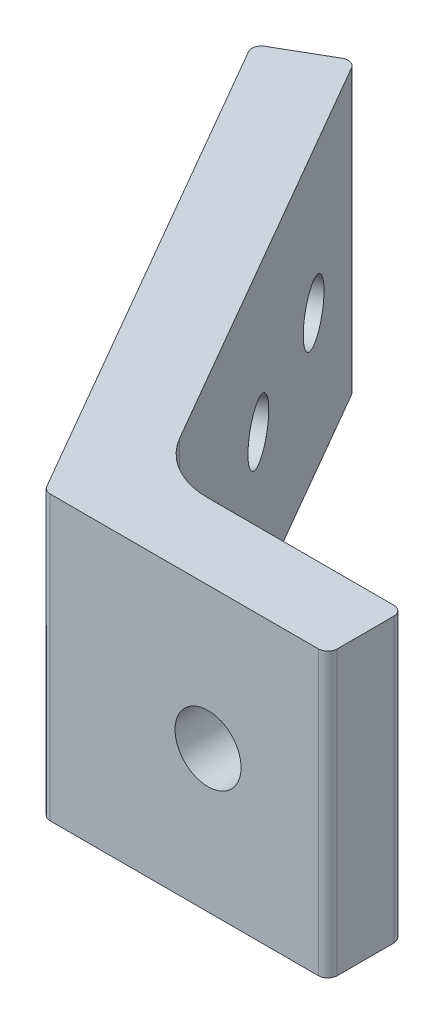
ISO-10303-21;
HEADER;
FILE_DESCRIPTION(('STEP AP214'),'2;1');
FILE_NAME('part.step','',(''),(''),'','','');
FILE_SCHEMA(('AUTOMOTIVE_DESIGN { 1 0 10303 214 1 1 1 1 }'));
ENDSEC;
DATA;
#1=APPLICATION_CONTEXT('core data for automotive mechanical design processes');
#2=APPLICATION_PROTOCOL_DEFINITION('international standard','automotive_design',2000,#1);
#3=PRODUCT_CONTEXT('',#1,'mechanical');
#4=PRODUCT('Part','Part','',(#3));
#5=PRODUCT_RELATED_PRODUCT_CATEGORY('part','',(#4));
#6=PRODUCT_DEFINITION_FORMATION('','',#4);
#7=PRODUCT_DEFINITION_CONTEXT('part definition',#1,'design');
#8=PRODUCT_DEFINITION('design','',#6,#7);
#9=PRODUCT_DEFINITION_SHAPE('','',#8);
#10=(LENGTH_UNIT() NAMED_UNIT(*) SI_UNIT(.MILLI.,.METRE.));
#11=(NAMED_UNIT(*) PLANE_ANGLE_UNIT() SI_UNIT($,.RADIAN.));
#12=(NAMED_UNIT(*) SI_UNIT($,.STERADIAN.) SOLID_ANGLE_UNIT());
#13=UNCERTAINTY_MEASURE_WITH_UNIT(LENGTH_MEASURE(1.E-05),#10,'distance_accuracy_value','');
#14=(GEOMETRIC_REPRESENTATION_CONTEXT(3) GLOBAL_UNCERTAINTY_ASSIGNED_CONTEXT((#13)) GLOBAL_UNIT_ASSIGNED_CONTEXT((#10,
#11,#12)) REPRESENTATION_CONTEXT('',''));
#15=CARTESIAN_POINT('',(0.,0.,0.));
#16=DIRECTION('',(0.,0.,1.));
#17=DIRECTION('',(1.,0.,0.));
#18=AXIS2_PLACEMENT_3D('',#15,#16,#17);
#19=CARTESIAN_POINT('',(-13.5262794416288,7.5,-1.42820323027553));
#20=DIRECTION('',(0.86602540378444,0.,-0.499999999999998));
#21=DIRECTION('',(-0.499999999999998,0.,-0.86602540378444));
#22=AXIS2_PLACEMENT_3D('',#19,#20,#21);
#23=CYLINDRICAL_SURFACE('',#22,1.5);
#24=CARTESIAN_POINT('',(-0.535898384862232,7.5,-8.92820323027551));
#25=DIRECTION('',(0.86602540378444,0.,-0.499999999999998));
#26=DIRECTION('',(-0.499999999999998,0.,-0.86602540378444));
#27=AXIS2_PLACEMENT_3D('',#24,#25,#26);
#28=CIRCLE('',#27,1.5);
#29=CARTESIAN_POINT('',(-1.28589838486223,7.5,-10.2272413359522));
#30=VERTEX_POINT('',#29);
#31=EDGE_CURVE('E170',#30,#30,#28,.T.);
#32=ORIENTED_EDGE('',*,*,#31,.T.);
#33=EDGE_LOOP('',(#32));
#34=FACE_BOUND('',#33,.T.);
#35=CARTESIAN_POINT('',(-3.99999999999999,7.5,-6.92820323027551));
#36=DIRECTION('',(0.86602540378444,0.,-0.499999999999998));
#37=DIRECTION('',(-0.499999999999998,0.,-0.86602540378444));
#38=AXIS2_PLACEMENT_3D('',#35,#36,#37);
#39=CIRCLE('',#38,1.5);
#40=CARTESIAN_POINT('',(-4.74999999999999,7.5,-8.22724133595218));
#41=VERTEX_POINT('',#40);
#42=EDGE_CURVE('E148',#41,#41,#39,.T.);
#43=ORIENTED_EDGE('',*,*,#42,.F.);
#44=EDGE_LOOP('',(#43));
#45=FACE_BOUND('',#44,.T.);
#46=ADVANCED_FACE('F35',(#34,#45),#23,.F.);
#47=CARTESIAN_POINT('',(0.,15.,0.));
#48=DIRECTION('',(0.,0.,-1.));
#49=DIRECTION('',(-1.,0.,0.));
#50=AXIS2_PLACEMENT_3D('',#47,#48,#49);
#51=PLANE('',#50);
#52=CARTESIAN_POINT('',(8.65470053837925,7.5,0.));
#53=DIRECTION('',(0.,0.,-1.));
#54=DIRECTION('',(-1.,0.,0.));
#55=AXIS2_PLACEMENT_3D('',#52,#53,#54);
#56=CIRCLE('',#55,1.75);
#57=CARTESIAN_POINT('',(6.90470053837925,7.5,0.));
#58=VERTEX_POINT('',#57);
#59=EDGE_CURVE('E246',#58,#58,#56,.T.);
#60=ORIENTED_EDGE('',*,*,#59,.T.);
#61=EDGE_LOOP('',(#60));
#62=FACE_BOUND('',#61,.T.);
#63=DIRECTION('',(1.,0.,0.));
#64=VECTOR('',#63,1.);
#65=CARTESIAN_POINT('',(0.,15.,0.));
#66=LINE('',#65,#64);
#67=CARTESIAN_POINT('',(0.288675134594815,15.,0.));
#68=VERTEX_POINT('',#67);
#69=CARTESIAN_POINT('',(14.5,15.,0.));
#70=VERTEX_POINT('',#69);
#71=EDGE_CURVE('E164',#68,#70,#66,.T.);
#72=ORIENTED_EDGE('',*,*,#71,.F.);
#73=DIRECTION('',(0.,-1.,0.));
#74=VECTOR('',#73,1.);
#75=CARTESIAN_POINT('',(0.288675134594815,15.,0.));
#76=LINE('',#75,#74);
#77=CARTESIAN_POINT('',(0.288675134594815,0.,0.));
#78=VERTEX_POINT('',#77);
#79=EDGE_CURVE('E209',#68,#78,#76,.T.);
#80=ORIENTED_EDGE('',*,*,#79,.T.);
#81=DIRECTION('',(1.,0.,0.));
#82=VECTOR('',#81,1.);
#83=CARTESIAN_POINT('',(0.,0.,0.));
#84=LINE('',#83,#82);
#85=CARTESIAN_POINT('',(14.5,0.,0.));
#86=VERTEX_POINT('',#85);
#87=EDGE_CURVE('E168',#78,#86,#84,.T.);
#88=ORIENTED_EDGE('',*,*,#87,.T.);
#89=DIRECTION('',(0.,-1.,0.));
#90=VECTOR('',#89,1.);
#91=CARTESIAN_POINT('',(14.5,15.,0.));
#92=LINE('',#91,#90);
#93=EDGE_CURVE('E207',#86,#70,#92,.F.);
#94=ORIENTED_EDGE('',*,*,#93,.T.);
#95=EDGE_LOOP('',(#72,#80,#88,#94));
#96=FACE_BOUND('',#95,.T.);
#97=ADVANCED_FACE('F269',(#62,#96),#51,.F.);
#98=CARTESIAN_POINT('',(15.,15.,-4.));
#99=DIRECTION('',(-1.,0.,0.));
#100=DIRECTION('',(0.,0.,1.));
#101=AXIS2_PLACEMENT_3D('',#98,#99,#100);
#102=PLANE('',#101);
#103=DIRECTION('',(0.,0.,-1.));
#104=VECTOR('',#103,1.);
#105=CARTESIAN_POINT('',(15.,15.,-4.));
#106=LINE('',#105,#104);
#107=CARTESIAN_POINT('',(15.,15.,-0.499999999999997));
#108=VERTEX_POINT('',#107);
#109=CARTESIAN_POINT('',(15.,15.,-3.5));
#110=VERTEX_POINT('',#109);
#111=EDGE_CURVE('E222',#108,#110,#106,.T.);
#112=ORIENTED_EDGE('',*,*,#111,.F.);
#113=DIRECTION('',(0.,-1.,0.));
#114=VECTOR('',#113,1.);
#115=CARTESIAN_POINT('',(15.,15.,-0.499999999999997));
#116=LINE('',#115,#114);
#117=CARTESIAN_POINT('',(15.,0.,-0.499999999999997));
#118=VERTEX_POINT('',#117);
#119=EDGE_CURVE('E43',#108,#118,#116,.T.);
#120=ORIENTED_EDGE('',*,*,#119,.T.);
#121=DIRECTION('',(0.,0.,-1.));
#122=VECTOR('',#121,1.);
#123=CARTESIAN_POINT('',(15.,0.,-4.));
#124=LINE('',#123,#122);
#125=CARTESIAN_POINT('',(15.,0.,-3.5));
#126=VERTEX_POINT('',#125);
#127=EDGE_CURVE('E159',#118,#126,#124,.T.);
#128=ORIENTED_EDGE('',*,*,#127,.T.);
#129=DIRECTION('',(0.,-1.,0.));
#130=VECTOR('',#129,1.);
#131=CARTESIAN_POINT('',(15.,15.,-3.5));
#132=LINE('',#131,#130);
#133=EDGE_CURVE('E212',#126,#110,#132,.F.);
#134=ORIENTED_EDGE('',*,*,#133,.T.);
#135=EDGE_LOOP('',(#112,#120,#128,#134));
#136=FACE_BOUND('',#135,.T.);
#137=ADVANCED_FACE('F219',(#136),#102,.F.);
#138=CARTESIAN_POINT('',(2.3094010767585,15.,-4.));
#139=DIRECTION('',(0.,0.,1.));
#140=DIRECTION('',(1.,0.,0.));
#141=AXIS2_PLACEMENT_3D('',#138,#139,#140);
#142=PLANE('',#141);
#143=CARTESIAN_POINT('',(8.65470053837925,7.5,-4.));
#144=DIRECTION('',(0.,0.,-1.));
#145=DIRECTION('',(-1.,0.,0.));
#146=AXIS2_PLACEMENT_3D('',#143,#144,#145);
#147=CIRCLE('',#146,1.75);
#148=CARTESIAN_POINT('',(6.90470053837925,7.5,-4.));
#149=VERTEX_POINT('',#148);
#150=EDGE_CURVE('E249',#149,#149,#147,.T.);
#151=ORIENTED_EDGE('',*,*,#150,.F.);
#152=EDGE_LOOP('',(#151));
#153=FACE_BOUND('',#152,.T.);
#154=DIRECTION('',(-1.,0.,0.));
#155=VECTOR('',#154,1.);
#156=CARTESIAN_POINT('',(2.3094010767585,15.,-4.));
#157=LINE('',#156,#155);
#158=CARTESIAN_POINT('',(14.5,15.,-4.));
#159=VERTEX_POINT('',#158);
#160=CARTESIAN_POINT('',(4.61880215351701,15.,-4.));
#161=VERTEX_POINT('',#160);
#162=EDGE_CURVE('E233',#159,#161,#157,.T.);
#163=ORIENTED_EDGE('',*,*,#162,.F.);
#164=DIRECTION('',(0.,-1.,0.));
#165=VECTOR('',#164,1.);
#166=CARTESIAN_POINT('',(14.5,15.,-4.));
#167=LINE('',#166,#165);
#168=CARTESIAN_POINT('',(14.5,0.,-4.));
#169=VERTEX_POINT('',#168);
#170=EDGE_CURVE('E11',#159,#169,#167,.T.);
#171=ORIENTED_EDGE('',*,*,#170,.T.);
#172=DIRECTION('',(-1.,0.,0.));
#173=VECTOR('',#172,1.);
#174=CARTESIAN_POINT('',(2.3094010767585,0.,-4.));
#175=LINE('',#174,#173);
#176=CARTESIAN_POINT('',(4.61880215351701,0.,-4.));
#177=VERTEX_POINT('',#176);
#178=EDGE_CURVE('E154',#169,#177,#175,.T.);
#179=ORIENTED_EDGE('',*,*,#178,.T.);
#180=DIRECTION('',(0.,-1.,0.));
#181=VECTOR('',#180,1.);
#182=CARTESIAN_POINT('',(4.61880215351701,15.,-4.));
#183=LINE('',#182,#181);
#184=EDGE_CURVE('E133',#177,#161,#183,.F.);
#185=ORIENTED_EDGE('',*,*,#184,.T.);
#186=EDGE_LOOP('',(#163,#171,#179,#185));
#187=FACE_BOUND('',#186,.T.);
#188=ADVANCED_FACE('F256',(#153,#187),#142,.F.);
#189=CARTESIAN_POINT('',(-11.5358983848622,15.,-27.9807621135332));
#190=DIRECTION('',(-0.86602540378444,0.,0.499999999999998));
#191=DIRECTION('',(0.499999999999998,0.,0.86602540378444));
#192=AXIS2_PLACEMENT_3D('',#189,#190,#191);
#193=PLANE('',#192);
#194=CARTESIAN_POINT('',(-4.53589838486222,7.5,-15.856406460551));
#195=DIRECTION('',(0.86602540378444,0.,-0.499999999999998));
#196=DIRECTION('',(-0.499999999999998,0.,-0.86602540378444));
#197=AXIS2_PLACEMENT_3D('',#194,#195,#196);
#198=CIRCLE('',#197,1.5);
#199=CARTESIAN_POINT('',(-5.28589838486221,7.5,-17.1554445662277));
#200=VERTEX_POINT('',#199);
#201=EDGE_CURVE('E243',#200,#200,#198,.T.);
#202=ORIENTED_EDGE('',*,*,#201,.F.);
#203=EDGE_LOOP('',(#202));
#204=FACE_BOUND('',#203,.T.);
#205=CARTESIAN_POINT('',(-8.5358983848622,7.5,-22.7846096908265));
#206=DIRECTION('',(0.86602540378444,0.,-0.499999999999998));
#207=DIRECTION('',(-0.499999999999998,0.,-0.86602540378444));
#208=AXIS2_PLACEMENT_3D('',#205,#206,#207);
#209=CIRCLE('',#208,1.5);
#210=CARTESIAN_POINT('',(-9.2858983848622,7.5,-24.0836477965032));
#211=VERTEX_POINT('',#210);
#212=EDGE_CURVE('E169',#211,#211,#209,.T.);
#213=ORIENTED_EDGE('',*,*,#212,.F.);
#214=EDGE_LOOP('',(#213));
#215=FACE_BOUND('',#214,.T.);
#216=DIRECTION('',(-0.499999999999998,0.,-0.86602540378444));
#217=VECTOR('',#216,1.);
#218=CARTESIAN_POINT('',(-11.5358983848622,0.,-27.9807621135332));
#219=LINE('',#218,#217);
#220=CARTESIAN_POINT('',(1.15470053837925,0.,-6.00000000000001));
#221=VERTEX_POINT('',#220);
#222=CARTESIAN_POINT('',(-11.2858983848622,0.,-27.547749411641));
#223=VERTEX_POINT('',#222);
#224=EDGE_CURVE('E144',#221,#223,#219,.T.);
#225=ORIENTED_EDGE('',*,*,#224,.T.);
#226=DIRECTION('',(0.,-1.,0.));
#227=VECTOR('',#226,1.);
#228=CARTESIAN_POINT('',(-11.2858983848622,15.,-27.547749411641));
#229=LINE('',#228,#227);
#230=CARTESIAN_POINT('',(-11.2858983848622,15.,-27.547749411641));
#231=VERTEX_POINT('',#230);
#232=EDGE_CURVE('E192',#223,#231,#229,.F.);
#233=ORIENTED_EDGE('',*,*,#232,.T.);
#234=DIRECTION('',(-0.499999999999998,0.,-0.86602540378444));
#235=VECTOR('',#234,1.);
#236=CARTESIAN_POINT('',(-11.5358983848622,15.,-27.9807621135332));
#237=LINE('',#236,#235);
#238=CARTESIAN_POINT('',(1.15470053837925,15.,-6.00000000000001));
#239=VERTEX_POINT('',#238);
#240=EDGE_CURVE('E147',#239,#231,#237,.T.);
#241=ORIENTED_EDGE('',*,*,#240,.F.);
#242=DIRECTION('',(0.,-1.,0.));
#243=VECTOR('',#242,1.);
#244=CARTESIAN_POINT('',(1.15470053837925,0.,-6.00000000000001));
#245=LINE('',#244,#243);
#246=EDGE_CURVE('E131',#239,#221,#245,.T.);
#247=ORIENTED_EDGE('',*,*,#246,.T.);
#248=EDGE_LOOP('',(#225,#233,#241,#247));
#249=FACE_BOUND('',#248,.T.);
#250=ORIENTED_EDGE('',*,*,#31,.F.);
#251=EDGE_LOOP('',(#250));
#252=FACE_BOUND('',#251,.T.);
#253=ADVANCED_FACE('F142',(#204,#215,#249,#252),#193,.F.);
#254=CARTESIAN_POINT('',(-14.9999999999999,15.,-25.9807621135332));
#255=DIRECTION('',(0.499999999999997,0.,0.86602540378444));
#256=DIRECTION('',(0.86602540378444,0.,-0.499999999999997));
#257=AXIS2_PLACEMENT_3D('',#254,#255,#256);
#258=PLANE('',#257);
#259=DIRECTION('',(-0.86602540378444,0.,0.499999999999997));
#260=VECTOR('',#259,1.);
#261=CARTESIAN_POINT('',(-14.9999999999999,15.,-25.9807621135332));
#262=LINE('',#261,#260);
#263=CARTESIAN_POINT('',(-11.9689110867544,15.,-27.7307621135332));
#264=VERTEX_POINT('',#263);
#265=CARTESIAN_POINT('',(-14.5669872981077,15.,-26.2307621135332));
#266=VERTEX_POINT('',#265);
#267=EDGE_CURVE('E230',#264,#266,#262,.T.);
#268=ORIENTED_EDGE('',*,*,#267,.F.);
#269=DIRECTION('',(0.,-1.,0.));
#270=VECTOR('',#269,1.);
#271=CARTESIAN_POINT('',(-11.9689110867544,15.,-27.7307621135332));
#272=LINE('',#271,#270);
#273=CARTESIAN_POINT('',(-11.9689110867544,0.,-27.7307621135332));
#274=VERTEX_POINT('',#273);
#275=EDGE_CURVE('E180',#264,#274,#272,.T.);
#276=ORIENTED_EDGE('',*,*,#275,.T.);
#277=DIRECTION('',(-0.86602540378444,0.,0.499999999999997));
#278=VECTOR('',#277,1.);
#279=CARTESIAN_POINT('',(-14.9999999999999,0.,-25.9807621135332));
#280=LINE('',#279,#278);
#281=CARTESIAN_POINT('',(-14.5669872981077,0.,-26.2307621135332));
#282=VERTEX_POINT('',#281);
#283=EDGE_CURVE('E153',#274,#282,#280,.T.);
#284=ORIENTED_EDGE('',*,*,#283,.T.);
#285=DIRECTION('',(0.,-1.,0.));
#286=VECTOR('',#285,1.);
#287=CARTESIAN_POINT('',(-14.5669872981077,15.,-26.2307621135332));
#288=LINE('',#287,#286);
#289=EDGE_CURVE('E178',#282,#266,#288,.F.);
#290=ORIENTED_EDGE('',*,*,#289,.T.);
#291=EDGE_LOOP('',(#268,#276,#284,#290));
#292=FACE_BOUND('',#291,.T.);
#293=ADVANCED_FACE('F283',(#292),#258,.F.);
#294=CARTESIAN_POINT('',(-14.9999999999999,15.,-25.9807621135332));
#295=DIRECTION('',(0.86602540378444,0.,-0.499999999999998));
#296=DIRECTION('',(-0.499999999999998,0.,-0.86602540378444));
#297=AXIS2_PLACEMENT_3D('',#294,#295,#296);
#298=PLANE('',#297);
#299=CARTESIAN_POINT('',(-7.99999999999997,7.5,-13.856406460551));
#300=DIRECTION('',(0.86602540378444,0.,-0.499999999999998));
#301=DIRECTION('',(-0.499999999999998,0.,-0.86602540378444));
#302=AXIS2_PLACEMENT_3D('',#299,#300,#301);
#303=CIRCLE('',#302,1.5);
#304=CARTESIAN_POINT('',(-8.74999999999997,7.5,-15.1554445662277));
#305=VERTEX_POINT('',#304);
#306=EDGE_CURVE('E240',#305,#305,#303,.T.);
#307=ORIENTED_EDGE('',*,*,#306,.T.);
#308=EDGE_LOOP('',(#307));
#309=FACE_BOUND('',#308,.T.);
#310=CARTESIAN_POINT('',(-12.,7.5,-20.7846096908266));
#311=DIRECTION('',(0.86602540378444,0.,-0.499999999999998));
#312=DIRECTION('',(-0.499999999999998,0.,-0.86602540378444));
#313=AXIS2_PLACEMENT_3D('',#310,#311,#312);
#314=CIRCLE('',#313,1.5);
#315=CARTESIAN_POINT('',(-12.75,7.5,-22.0836477965032));
#316=VERTEX_POINT('',#315);
#317=EDGE_CURVE('E165',#316,#316,#314,.T.);
#318=ORIENTED_EDGE('',*,*,#317,.T.);
#319=EDGE_LOOP('',(#318));
#320=FACE_BOUND('',#319,.T.);
#321=DIRECTION('',(0.499999999999998,0.,0.86602540378444));
#322=VECTOR('',#321,1.);
#323=CARTESIAN_POINT('',(-14.9999999999999,15.,-25.9807621135332));
#324=LINE('',#323,#322);
#325=CARTESIAN_POINT('',(-14.7499999999999,15.,-25.547749411641));
#326=VERTEX_POINT('',#325);
#327=CARTESIAN_POINT('',(-0.144337567297405,15.,-0.25));
#328=VERTEX_POINT('',#327);
#329=EDGE_CURVE('E173',#326,#328,#324,.T.);
#330=ORIENTED_EDGE('',*,*,#329,.F.);
#331=DIRECTION('',(0.,-1.,0.));
#332=VECTOR('',#331,1.);
#333=CARTESIAN_POINT('',(-14.7499999999999,15.,-25.547749411641));
#334=LINE('',#333,#332);
#335=CARTESIAN_POINT('',(-14.7499999999999,0.,-25.547749411641));
#336=VERTEX_POINT('',#335);
#337=EDGE_CURVE('E204',#326,#336,#334,.T.);
#338=ORIENTED_EDGE('',*,*,#337,.T.);
#339=DIRECTION('',(0.499999999999998,0.,0.86602540378444));
#340=VECTOR('',#339,1.);
#341=CARTESIAN_POINT('',(-14.9999999999999,0.,-25.9807621135332));
#342=LINE('',#341,#340);
#343=CARTESIAN_POINT('',(-0.144337567297405,0.,-0.25));
#344=VERTEX_POINT('',#343);
#345=EDGE_CURVE('E157',#336,#344,#342,.T.);
#346=ORIENTED_EDGE('',*,*,#345,.T.);
#347=DIRECTION('',(0.,-1.,0.));
#348=VECTOR('',#347,1.);
#349=CARTESIAN_POINT('',(-0.144337567297405,15.,-0.25));
#350=LINE('',#349,#348);
#351=EDGE_CURVE('E50',#344,#328,#350,.F.);
#352=ORIENTED_EDGE('',*,*,#351,.T.);
#353=EDGE_LOOP('',(#330,#338,#346,#352));
#354=FACE_BOUND('',#353,.T.);
#355=ORIENTED_EDGE('',*,*,#42,.T.);
#356=EDGE_LOOP('',(#355));
#357=FACE_BOUND('',#356,.T.);
#358=ADVANCED_FACE('F273',(#309,#320,#354,#357),#298,.F.);
#359=CARTESIAN_POINT('',(0.,15.,0.));
#360=DIRECTION('',(0.,-1.,0.));
#361=DIRECTION('',(0.,0.,-1.));
#362=AXIS2_PLACEMENT_3D('',#359,#360,#361);
#363=PLANE('',#362);
#364=ORIENTED_EDGE('',*,*,#240,.T.);
#365=CARTESIAN_POINT('',(-11.7189110867544,15.,-27.297749411641));
#366=DIRECTION('',(0.,-1.,0.));
#367=DIRECTION('',(0.,0.,-1.));
#368=AXIS2_PLACEMENT_3D('',#365,#366,#367);
#369=CIRCLE('',#368,0.5);
#370=EDGE_CURVE('E201',#231,#264,#369,.F.);
#371=ORIENTED_EDGE('',*,*,#370,.T.);
#372=ORIENTED_EDGE('',*,*,#267,.T.);
#373=CARTESIAN_POINT('',(-14.3169872981077,15.,-25.797749411641));
#374=DIRECTION('',(0.,-1.,0.));
#375=DIRECTION('',(0.,0.,-1.));
#376=AXIS2_PLACEMENT_3D('',#373,#374,#375);
#377=CIRCLE('',#376,0.5);
#378=EDGE_CURVE('E57',#266,#326,#377,.F.);
#379=ORIENTED_EDGE('',*,*,#378,.T.);
#380=ORIENTED_EDGE('',*,*,#329,.T.);
#381=CARTESIAN_POINT('',(0.288675134594815,15.,-0.5));
#382=DIRECTION('',(0.,-1.,0.));
#383=DIRECTION('',(0.,0.,-1.));
#384=AXIS2_PLACEMENT_3D('',#381,#382,#383);
#385=CIRCLE('',#384,0.5);
#386=EDGE_CURVE('E198',#328,#68,#385,.F.);
#387=ORIENTED_EDGE('',*,*,#386,.T.);
#388=ORIENTED_EDGE('',*,*,#71,.T.);
#389=CARTESIAN_POINT('',(14.5,15.,-0.499999999999997));
#390=DIRECTION('',(0.,-1.,0.));
#391=DIRECTION('',(0.,0.,-1.));
#392=AXIS2_PLACEMENT_3D('',#389,#390,#391);
#393=CIRCLE('',#392,0.5);
#394=EDGE_CURVE('E196',#70,#108,#393,.F.);
#395=ORIENTED_EDGE('',*,*,#394,.T.);
#396=ORIENTED_EDGE('',*,*,#111,.T.);
#397=CARTESIAN_POINT('',(14.5,15.,-3.5));
#398=DIRECTION('',(0.,-1.,0.));
#399=DIRECTION('',(0.,0.,-1.));
#400=AXIS2_PLACEMENT_3D('',#397,#398,#399);
#401=CIRCLE('',#400,0.5);
#402=EDGE_CURVE('E194',#110,#159,#401,.F.);
#403=ORIENTED_EDGE('',*,*,#402,.T.);
#404=ORIENTED_EDGE('',*,*,#162,.T.);
#405=CARTESIAN_POINT('',(4.61880215351701,15.,-8.));
#406=DIRECTION('',(0.,-1.,0.));
#407=DIRECTION('',(0.,0.,-1.));
#408=AXIS2_PLACEMENT_3D('',#405,#406,#407);
#409=CIRCLE('',#408,4.);
#410=EDGE_CURVE('E137',#161,#239,#409,.T.);
#411=ORIENTED_EDGE('',*,*,#410,.T.);
#412=EDGE_LOOP('',(#364,#371,#372,#379,#380,#387,#388,#395,#396,#403,#404,#411));
#413=FACE_BOUND('',#412,.T.);
#414=ADVANCED_FACE('F264',(#413),#363,.F.);
#415=CARTESIAN_POINT('',(0.,0.,0.));
#416=DIRECTION('',(0.,-1.,0.));
#417=DIRECTION('',(0.,0.,-1.));
#418=AXIS2_PLACEMENT_3D('',#415,#416,#417);
#419=PLANE('',#418);
#420=ORIENTED_EDGE('',*,*,#283,.F.);
#421=CARTESIAN_POINT('',(-11.7189110867544,0.,-27.297749411641));
#422=DIRECTION('',(0.,-1.,0.));
#423=DIRECTION('',(0.,0.,-1.));
#424=AXIS2_PLACEMENT_3D('',#421,#422,#423);
#425=CIRCLE('',#424,0.5);
#426=EDGE_CURVE('E152',#274,#223,#425,.T.);
#427=ORIENTED_EDGE('',*,*,#426,.T.);
#428=ORIENTED_EDGE('',*,*,#224,.F.);
#429=CARTESIAN_POINT('',(4.61880215351701,0.,-8.));
#430=DIRECTION('',(0.,-1.,0.));
#431=DIRECTION('',(0.,0.,-1.));
#432=AXIS2_PLACEMENT_3D('',#429,#430,#431);
#433=CIRCLE('',#432,4.);
#434=EDGE_CURVE('E127',#221,#177,#433,.F.);
#435=ORIENTED_EDGE('',*,*,#434,.T.);
#436=ORIENTED_EDGE('',*,*,#178,.F.);
#437=CARTESIAN_POINT('',(14.5,0.,-3.5));
#438=DIRECTION('',(0.,-1.,0.));
#439=DIRECTION('',(0.,0.,-1.));
#440=AXIS2_PLACEMENT_3D('',#437,#438,#439);
#441=CIRCLE('',#440,0.5);
#442=EDGE_CURVE('E183',#169,#126,#441,.T.);
#443=ORIENTED_EDGE('',*,*,#442,.T.);
#444=ORIENTED_EDGE('',*,*,#127,.F.);
#445=CARTESIAN_POINT('',(14.5,0.,-0.499999999999997));
#446=DIRECTION('',(0.,-1.,0.));
#447=DIRECTION('',(0.,0.,-1.));
#448=AXIS2_PLACEMENT_3D('',#445,#446,#447);
#449=CIRCLE('',#448,0.5);
#450=EDGE_CURVE('E185',#118,#86,#449,.T.);
#451=ORIENTED_EDGE('',*,*,#450,.T.);
#452=ORIENTED_EDGE('',*,*,#87,.F.);
#453=CARTESIAN_POINT('',(0.288675134594815,0.,-0.5));
#454=DIRECTION('',(0.,-1.,0.));
#455=DIRECTION('',(0.,0.,-1.));
#456=AXIS2_PLACEMENT_3D('',#453,#454,#455);
#457=CIRCLE('',#456,0.5);
#458=EDGE_CURVE('E187',#78,#344,#457,.T.);
#459=ORIENTED_EDGE('',*,*,#458,.T.);
#460=ORIENTED_EDGE('',*,*,#345,.F.);
#461=CARTESIAN_POINT('',(-14.3169872981077,0.,-25.797749411641));
#462=DIRECTION('',(0.,-1.,0.));
#463=DIRECTION('',(0.,0.,-1.));
#464=AXIS2_PLACEMENT_3D('',#461,#462,#463);
#465=CIRCLE('',#464,0.5);
#466=EDGE_CURVE('E189',#336,#282,#465,.T.);
#467=ORIENTED_EDGE('',*,*,#466,.T.);
#468=EDGE_LOOP('',(#420,#427,#428,#435,#436,#443,#444,#451,#452,#459,#460,#467));
#469=FACE_BOUND('',#468,.T.);
#470=ADVANCED_FACE('F151',(#469),#419,.T.);
#471=CARTESIAN_POINT('',(-21.5262794416288,7.5,-15.2846096908266));
#472=DIRECTION('',(0.86602540378444,0.,-0.499999999999998));
#473=DIRECTION('',(-0.499999999999998,0.,-0.86602540378444));
#474=AXIS2_PLACEMENT_3D('',#471,#472,#473);
#475=CYLINDRICAL_SURFACE('',#474,1.5);
#476=ORIENTED_EDGE('',*,*,#212,.T.);
#477=EDGE_LOOP('',(#476));
#478=FACE_BOUND('',#477,.T.);
#479=ORIENTED_EDGE('',*,*,#317,.F.);
#480=EDGE_LOOP('',(#479));
#481=FACE_BOUND('',#480,.T.);
#482=ADVANCED_FACE('F318',(#478,#481),#475,.F.);
#483=CARTESIAN_POINT('',(-17.5262794416288,7.5,-8.35640646055105));
#484=DIRECTION('',(0.86602540378444,0.,-0.499999999999998));
#485=DIRECTION('',(-0.499999999999998,0.,-0.86602540378444));
#486=AXIS2_PLACEMENT_3D('',#483,#484,#485);
#487=CYLINDRICAL_SURFACE('',#486,1.5);
#488=ORIENTED_EDGE('',*,*,#201,.T.);
#489=EDGE_LOOP('',(#488));
#490=FACE_BOUND('',#489,.T.);
#491=ORIENTED_EDGE('',*,*,#306,.F.);
#492=EDGE_LOOP('',(#491));
#493=FACE_BOUND('',#492,.T.);
#494=ADVANCED_FACE('F323',(#490,#493),#487,.F.);
#495=CARTESIAN_POINT('',(8.65470053837925,7.5,11.));
#496=DIRECTION('',(0.,0.,-1.));
#497=DIRECTION('',(-1.,0.,0.));
#498=AXIS2_PLACEMENT_3D('',#495,#496,#497);
#499=CYLINDRICAL_SURFACE('',#498,1.75);
#500=ORIENTED_EDGE('',*,*,#150,.T.);
#501=EDGE_LOOP('',(#500));
#502=FACE_BOUND('',#501,.T.);
#503=ORIENTED_EDGE('',*,*,#59,.F.);
#504=EDGE_LOOP('',(#503));
#505=FACE_BOUND('',#504,.T.);
#506=ADVANCED_FACE('F253',(#502,#505),#499,.F.);
#507=CARTESIAN_POINT('',(4.61880215351701,15.,-8.));
#508=DIRECTION('',(0.,1.,0.));
#509=DIRECTION('',(0.,0.,1.));
#510=AXIS2_PLACEMENT_3D('',#507,#508,#509);
#511=CYLINDRICAL_SURFACE('',#510,4.);
#512=ORIENTED_EDGE('',*,*,#410,.F.);
#513=ORIENTED_EDGE('',*,*,#184,.F.);
#514=ORIENTED_EDGE('',*,*,#434,.F.);
#515=ORIENTED_EDGE('',*,*,#246,.F.);
#516=EDGE_LOOP('',(#512,#513,#514,#515));
#517=FACE_BOUND('',#516,.T.);
#518=ADVANCED_FACE('F130',(#517),#511,.F.);
#519=CARTESIAN_POINT('',(-11.7189110867544,15.,-27.297749411641));
#520=DIRECTION('',(0.,-1.,0.));
#521=DIRECTION('',(0.,0.,-1.));
#522=AXIS2_PLACEMENT_3D('',#519,#520,#521);
#523=CYLINDRICAL_SURFACE('',#522,0.5);
#524=ORIENTED_EDGE('',*,*,#370,.F.);
#525=ORIENTED_EDGE('',*,*,#232,.F.);
#526=ORIENTED_EDGE('',*,*,#426,.F.);
#527=ORIENTED_EDGE('',*,*,#275,.F.);
#528=EDGE_LOOP('',(#524,#525,#526,#527));
#529=FACE_BOUND('',#528,.T.);
#530=ADVANCED_FACE('F287',(#529),#523,.T.);
#531=CARTESIAN_POINT('',(-14.3169872981077,15.,-25.797749411641));
#532=DIRECTION('',(0.,-1.,0.));
#533=DIRECTION('',(0.,0.,-1.));
#534=AXIS2_PLACEMENT_3D('',#531,#532,#533);
#535=CYLINDRICAL_SURFACE('',#534,0.5);
#536=ORIENTED_EDGE('',*,*,#378,.F.);
#537=ORIENTED_EDGE('',*,*,#289,.F.);
#538=ORIENTED_EDGE('',*,*,#466,.F.);
#539=ORIENTED_EDGE('',*,*,#337,.F.);
#540=EDGE_LOOP('',(#536,#537,#538,#539));
#541=FACE_BOUND('',#540,.T.);
#542=ADVANCED_FACE('F279',(#541),#535,.T.);
#543=CARTESIAN_POINT('',(0.288675134594815,15.,-0.5));
#544=DIRECTION('',(0.,-1.,0.));
#545=DIRECTION('',(0.,0.,-1.));
#546=AXIS2_PLACEMENT_3D('',#543,#544,#545);
#547=CYLINDRICAL_SURFACE('',#546,0.5);
#548=ORIENTED_EDGE('',*,*,#386,.F.);
#549=ORIENTED_EDGE('',*,*,#351,.F.);
#550=ORIENTED_EDGE('',*,*,#458,.F.);
#551=ORIENTED_EDGE('',*,*,#79,.F.);
#552=EDGE_LOOP('',(#548,#549,#550,#551));
#553=FACE_BOUND('',#552,.T.);
#554=ADVANCED_FACE('F277',(#553),#547,.T.);
#555=CARTESIAN_POINT('',(14.5,15.,-0.499999999999997));
#556=DIRECTION('',(0.,-1.,0.));
#557=DIRECTION('',(0.,0.,-1.));
#558=AXIS2_PLACEMENT_3D('',#555,#556,#557);
#559=CYLINDRICAL_SURFACE('',#558,0.5);
#560=ORIENTED_EDGE('',*,*,#394,.F.);
#561=ORIENTED_EDGE('',*,*,#93,.F.);
#562=ORIENTED_EDGE('',*,*,#450,.F.);
#563=ORIENTED_EDGE('',*,*,#119,.F.);
#564=EDGE_LOOP('',(#560,#561,#562,#563));
#565=FACE_BOUND('',#564,.T.);
#566=ADVANCED_FACE('F267',(#565),#559,.T.);
#567=CARTESIAN_POINT('',(14.5,15.,-3.5));
#568=DIRECTION('',(0.,-1.,0.));
#569=DIRECTION('',(0.,0.,-1.));
#570=AXIS2_PLACEMENT_3D('',#567,#568,#569);
#571=CYLINDRICAL_SURFACE('',#570,0.5);
#572=ORIENTED_EDGE('',*,*,#402,.F.);
#573=ORIENTED_EDGE('',*,*,#133,.F.);
#574=ORIENTED_EDGE('',*,*,#442,.F.);
#575=ORIENTED_EDGE('',*,*,#170,.F.);
#576=EDGE_LOOP('',(#572,#573,#574,#575));
#577=FACE_BOUND('',#576,.T.);
#578=ADVANCED_FACE('F37',(#577),#571,.T.);
#579=CLOSED_SHELL('',(#46,#97,#137,#188,#253,#293,#358,#414,#470,#482,#494,#506,#518,#530,#542,
#554,#566,#578));
#580=MANIFOLD_SOLID_BREP('B2',#579);
#581=ADVANCED_BREP_SHAPE_REPRESENTATION('',(#18,#580),#14);
#582=SHAPE_DEFINITION_REPRESENTATION(#9,#581);
ENDSEC;
END-ISO-10303-21;
